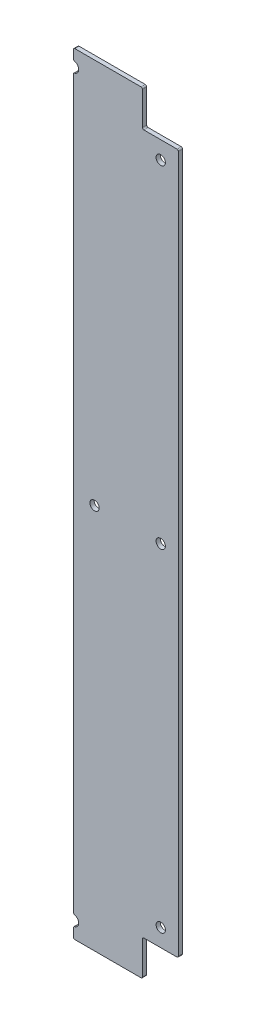
ISO-10303-21;
HEADER;
FILE_DESCRIPTION(('STEP AP214'),'2;1');
FILE_NAME('part.step','',(''),(''),'','','');
FILE_SCHEMA(('AUTOMOTIVE_DESIGN { 1 0 10303 214 1 1 1 1 }'));
ENDSEC;
DATA;
#1=APPLICATION_CONTEXT('core data for automotive mechanical design processes');
#2=APPLICATION_PROTOCOL_DEFINITION('international standard','automotive_design',2000,#1);
#3=PRODUCT_CONTEXT('',#1,'mechanical');
#4=PRODUCT('Part','Part','',(#3));
#5=PRODUCT_RELATED_PRODUCT_CATEGORY('part','',(#4));
#6=PRODUCT_DEFINITION_FORMATION('','',#4);
#7=PRODUCT_DEFINITION_CONTEXT('part definition',#1,'design');
#8=PRODUCT_DEFINITION('design','',#6,#7);
#9=PRODUCT_DEFINITION_SHAPE('','',#8);
#10=(LENGTH_UNIT() NAMED_UNIT(*) SI_UNIT(.MILLI.,.METRE.));
#11=(NAMED_UNIT(*) PLANE_ANGLE_UNIT() SI_UNIT($,.RADIAN.));
#12=(NAMED_UNIT(*) SI_UNIT($,.STERADIAN.) SOLID_ANGLE_UNIT());
#13=UNCERTAINTY_MEASURE_WITH_UNIT(LENGTH_MEASURE(1.E-05),#10,'distance_accuracy_value','');
#14=(GEOMETRIC_REPRESENTATION_CONTEXT(3) GLOBAL_UNCERTAINTY_ASSIGNED_CONTEXT((#13)) GLOBAL_UNIT_ASSIGNED_CONTEXT((#10,
#11,#12)) REPRESENTATION_CONTEXT('',''));
#15=CARTESIAN_POINT('',(0.,0.,0.));
#16=DIRECTION('',(0.,0.,1.));
#17=DIRECTION('',(1.,0.,0.));
#18=AXIS2_PLACEMENT_3D('',#15,#16,#17);
#19=CARTESIAN_POINT('',(25.5,522.5,3.));
#20=DIRECTION('',(1.,0.,0.));
#21=DIRECTION('',(0.,0.,-1.));
#22=AXIS2_PLACEMENT_3D('',#19,#20,#21);
#23=PLANE('',#22);
#24=DIRECTION('',(0.,-1.,0.));
#25=VECTOR('',#24,1.);
#26=CARTESIAN_POINT('',(25.5,522.5,3.));
#27=LINE('',#26,#25);
#28=CARTESIAN_POINT('',(25.5,-18.6435439052517,3.));
#29=VERTEX_POINT('',#28);
#30=CARTESIAN_POINT('',(25.5,-24.5,3.));
#31=VERTEX_POINT('',#30);
#32=EDGE_CURVE('E375',#29,#31,#27,.T.);
#33=ORIENTED_EDGE('',*,*,#32,.F.);
#34=DIRECTION('',(0.,0.,-1.));
#35=VECTOR('',#34,1.);
#36=CARTESIAN_POINT('',(25.5,-18.6435439052517,3.));
#37=LINE('',#36,#35);
#38=CARTESIAN_POINT('',(25.5,-18.6435439052517,0.));
#39=VERTEX_POINT('',#38);
#40=EDGE_CURVE('E315',#29,#39,#37,.T.);
#41=ORIENTED_EDGE('',*,*,#40,.T.);
#42=DIRECTION('',(0.,-1.,0.));
#43=VECTOR('',#42,1.);
#44=CARTESIAN_POINT('',(25.5,522.5,0.));
#45=LINE('',#44,#43);
#46=CARTESIAN_POINT('',(25.5,-24.5,0.));
#47=VERTEX_POINT('',#46);
#48=EDGE_CURVE('E236',#39,#47,#45,.T.);
#49=ORIENTED_EDGE('',*,*,#48,.T.);
#50=DIRECTION('',(0.,0.,-1.));
#51=VECTOR('',#50,1.);
#52=CARTESIAN_POINT('',(25.5,-24.5,3.));
#53=LINE('',#52,#51);
#54=EDGE_CURVE('E313',#47,#31,#53,.F.);
#55=ORIENTED_EDGE('',*,*,#54,.T.);
#56=EDGE_LOOP('',(#33,#41,#49,#55));
#57=FACE_BOUND('',#56,.T.);
#58=ADVANCED_FACE('F33',(#57),#23,.F.);
#59=CARTESIAN_POINT('',(25.5,506.356456094748,3.));
#60=VERTEX_POINT('',#59);
#61=CARTESIAN_POINT('',(25.5,-9.35645609474833,3.));
#62=VERTEX_POINT('',#61);
#63=EDGE_CURVE('E376',#60,#62,#27,.T.);
#64=ORIENTED_EDGE('',*,*,#63,.F.);
#65=DIRECTION('',(0.,0.,-1.));
#66=VECTOR('',#65,1.);
#67=CARTESIAN_POINT('',(25.5,506.356456094748,3.));
#68=LINE('',#67,#66);
#69=CARTESIAN_POINT('',(25.5,506.356456094748,0.));
#70=VERTEX_POINT('',#69);
#71=EDGE_CURVE('E306',#60,#70,#68,.T.);
#72=ORIENTED_EDGE('',*,*,#71,.T.);
#73=CARTESIAN_POINT('',(25.5,-9.35645609474833,0.));
#74=VERTEX_POINT('',#73);
#75=EDGE_CURVE('E241',#70,#74,#45,.T.);
#76=ORIENTED_EDGE('',*,*,#75,.T.);
#77=DIRECTION('',(0.,0.,-1.));
#78=VECTOR('',#77,1.);
#79=CARTESIAN_POINT('',(25.5,-9.35645609474833,3.));
#80=LINE('',#79,#78);
#81=EDGE_CURVE('E304',#74,#62,#80,.F.);
#82=ORIENTED_EDGE('',*,*,#81,.T.);
#83=EDGE_LOOP('',(#64,#72,#76,#82));
#84=FACE_BOUND('',#83,.T.);
#85=ADVANCED_FACE('F395',(#84),#23,.F.);
#86=CARTESIAN_POINT('',(0.,0.,0.));
#87=DIRECTION('',(0.,0.,1.));
#88=DIRECTION('',(1.,0.,0.));
#89=AXIS2_PLACEMENT_3D('',#86,#87,#88);
#90=PLANE('',#89);
#91=CARTESIAN_POINT('',(40.500000000009,248.500000000004,0.));
#92=DIRECTION('',(0.,0.,-1.));
#93=DIRECTION('',(-1.,0.,0.));
#94=AXIS2_PLACEMENT_3D('',#91,#92,#93);
#95=CIRCLE('',#94,3.29999999999999);
#96=CARTESIAN_POINT('',(37.200000000009,248.500000000004,0.));
#97=VERTEX_POINT('',#96);
#98=EDGE_CURVE('E702',#97,#97,#95,.T.);
#99=ORIENTED_EDGE('',*,*,#98,.F.);
#100=EDGE_LOOP('',(#99));
#101=FACE_BOUND('',#100,.T.);
#102=CARTESIAN_POINT('',(87.5,484.5,0.));
#103=DIRECTION('',(0.,0.,-1.));
#104=DIRECTION('',(-1.,0.,0.));
#105=AXIS2_PLACEMENT_3D('',#102,#103,#104);
#106=CIRCLE('',#105,3.29999999999998);
#107=CARTESIAN_POINT('',(84.2,484.5,0.));
#108=VERTEX_POINT('',#107);
#109=EDGE_CURVE('E690',#108,#108,#106,.T.);
#110=ORIENTED_EDGE('',*,*,#109,.F.);
#111=EDGE_LOOP('',(#110));
#112=FACE_BOUND('',#111,.T.);
#113=CARTESIAN_POINT('',(87.5,248.5,0.));
#114=DIRECTION('',(0.,0.,-1.));
#115=DIRECTION('',(-1.,0.,0.));
#116=AXIS2_PLACEMENT_3D('',#113,#114,#115);
#117=CIRCLE('',#116,3.29999999999998);
#118=CARTESIAN_POINT('',(84.2,248.5,0.));
#119=VERTEX_POINT('',#118);
#120=EDGE_CURVE('E681',#119,#119,#117,.T.);
#121=ORIENTED_EDGE('',*,*,#120,.F.);
#122=EDGE_LOOP('',(#121));
#123=FACE_BOUND('',#122,.T.);
#124=DIRECTION('',(-1.,0.,0.));
#125=VECTOR('',#124,1.);
#126=CARTESIAN_POINT('',(99.9999999999999,497.,0.));
#127=LINE('',#126,#125);
#128=CARTESIAN_POINT('',(98.9999999999999,497.,0.));
#129=VERTEX_POINT('',#128);
#130=CARTESIAN_POINT('',(75.5,497.,0.));
#131=VERTEX_POINT('',#130);
#132=EDGE_CURVE('E213',#129,#131,#127,.T.);
#133=ORIENTED_EDGE('',*,*,#132,.F.);
#134=CARTESIAN_POINT('',(98.9999999999999,496.,0.));
#135=DIRECTION('',(0.,0.,1.));
#136=DIRECTION('',(1.,0.,0.));
#137=AXIS2_PLACEMENT_3D('',#134,#135,#136);
#138=CIRCLE('',#137,1.);
#139=CARTESIAN_POINT('',(99.9999999999999,496.,0.));
#140=VERTEX_POINT('',#139);
#141=EDGE_CURVE('E196',#129,#140,#138,.F.);
#142=ORIENTED_EDGE('',*,*,#141,.T.);
#143=DIRECTION('',(0.,1.,0.));
#144=VECTOR('',#143,1.);
#145=CARTESIAN_POINT('',(100.,0.,0.));
#146=LINE('',#145,#144);
#147=CARTESIAN_POINT('',(100.,0.99999999999999,0.));
#148=VERTEX_POINT('',#147);
#149=EDGE_CURVE('E225',#148,#140,#146,.T.);
#150=ORIENTED_EDGE('',*,*,#149,.F.);
#151=CARTESIAN_POINT('',(99.,0.99999999999999,0.));
#152=DIRECTION('',(0.,0.,1.));
#153=DIRECTION('',(1.,0.,0.));
#154=AXIS2_PLACEMENT_3D('',#151,#152,#153);
#155=CIRCLE('',#154,1.);
#156=CARTESIAN_POINT('',(99.,0.,0.));
#157=VERTEX_POINT('',#156);
#158=EDGE_CURVE('E217',#148,#157,#155,.F.);
#159=ORIENTED_EDGE('',*,*,#158,.T.);
#160=DIRECTION('',(1.,0.,0.));
#161=VECTOR('',#160,1.);
#162=CARTESIAN_POINT('',(100.,0.,0.));
#163=LINE('',#162,#161);
#164=CARTESIAN_POINT('',(75.5,0.,0.));
#165=VERTEX_POINT('',#164);
#166=EDGE_CURVE('E230',#165,#157,#163,.T.);
#167=ORIENTED_EDGE('',*,*,#166,.F.);
#168=CARTESIAN_POINT('',(75.5,-1.00000000000001,0.));
#169=DIRECTION('',(0.,0.,1.));
#170=DIRECTION('',(1.,0.,0.));
#171=AXIS2_PLACEMENT_3D('',#168,#169,#170);
#172=CIRCLE('',#171,1.);
#173=CARTESIAN_POINT('',(74.5,-1.00000000000001,0.));
#174=VERTEX_POINT('',#173);
#175=EDGE_CURVE('E41',#165,#174,#172,.T.);
#176=ORIENTED_EDGE('',*,*,#175,.T.);
#177=DIRECTION('',(0.,1.,0.));
#178=VECTOR('',#177,1.);
#179=CARTESIAN_POINT('',(74.5,-25.5,0.));
#180=LINE('',#179,#178);
#181=CARTESIAN_POINT('',(74.5,-24.5,0.));
#182=VERTEX_POINT('',#181);
#183=EDGE_CURVE('E338',#182,#174,#180,.T.);
#184=ORIENTED_EDGE('',*,*,#183,.F.);
#185=CARTESIAN_POINT('',(73.5,-24.5,0.));
#186=DIRECTION('',(0.,0.,1.));
#187=DIRECTION('',(1.,0.,0.));
#188=AXIS2_PLACEMENT_3D('',#185,#186,#187);
#189=CIRCLE('',#188,1.);
#190=CARTESIAN_POINT('',(73.5,-25.5,0.));
#191=VERTEX_POINT('',#190);
#192=EDGE_CURVE('E248',#182,#191,#189,.F.);
#193=ORIENTED_EDGE('',*,*,#192,.T.);
#194=DIRECTION('',(1.,0.,0.));
#195=VECTOR('',#194,1.);
#196=CARTESIAN_POINT('',(25.5,-25.5,0.));
#197=LINE('',#196,#195);
#198=CARTESIAN_POINT('',(26.5,-25.5,0.));
#199=VERTEX_POINT('',#198);
#200=EDGE_CURVE('E240',#199,#191,#197,.T.);
#201=ORIENTED_EDGE('',*,*,#200,.F.);
#202=CARTESIAN_POINT('',(26.5,-24.5,0.));
#203=DIRECTION('',(0.,0.,1.));
#204=DIRECTION('',(1.,0.,0.));
#205=AXIS2_PLACEMENT_3D('',#202,#203,#204);
#206=CIRCLE('',#205,1.);
#207=EDGE_CURVE('E250',#199,#47,#206,.F.);
#208=ORIENTED_EDGE('',*,*,#207,.T.);
#209=ORIENTED_EDGE('',*,*,#48,.F.);
#210=CARTESIAN_POINT('',(26.5,-18.6435439052517,0.));
#211=DIRECTION('',(0.,0.,1.));
#212=DIRECTION('',(1.,0.,0.));
#213=AXIS2_PLACEMENT_3D('',#210,#211,#212);
#214=CIRCLE('',#213,1.);
#215=CARTESIAN_POINT('',(26.2894736842105,-17.6659557146724,0.));
#216=VERTEX_POINT('',#215);
#217=EDGE_CURVE('E252',#39,#216,#214,.F.);
#218=ORIENTED_EDGE('',*,*,#217,.T.);
#219=CARTESIAN_POINT('',(25.5,-14.,0.));
#220=DIRECTION('',(0.,0.,-1.));
#221=DIRECTION('',(-1.,0.,0.));
#222=AXIS2_PLACEMENT_3D('',#219,#220,#221);
#223=CIRCLE('',#222,3.75);
#224=CARTESIAN_POINT('',(26.2894736842105,-10.3340442853276,0.));
#225=VERTEX_POINT('',#224);
#226=EDGE_CURVE('E711',#225,#216,#223,.T.);
#227=ORIENTED_EDGE('',*,*,#226,.F.);
#228=CARTESIAN_POINT('',(26.5,-9.35645609474834,0.));
#229=DIRECTION('',(0.,0.,1.));
#230=DIRECTION('',(1.,0.,0.));
#231=AXIS2_PLACEMENT_3D('',#228,#229,#230);
#232=CIRCLE('',#231,1.);
#233=EDGE_CURVE('E254',#225,#74,#232,.F.);
#234=ORIENTED_EDGE('',*,*,#233,.T.);
#235=ORIENTED_EDGE('',*,*,#75,.F.);
#236=CARTESIAN_POINT('',(26.5,506.356456094748,0.));
#237=DIRECTION('',(0.,0.,1.));
#238=DIRECTION('',(1.,0.,0.));
#239=AXIS2_PLACEMENT_3D('',#236,#237,#238);
#240=CIRCLE('',#239,1.);
#241=CARTESIAN_POINT('',(26.2894736842105,507.334044285328,0.));
#242=VERTEX_POINT('',#241);
#243=EDGE_CURVE('E256',#70,#242,#240,.F.);
#244=ORIENTED_EDGE('',*,*,#243,.T.);
#245=CARTESIAN_POINT('',(25.5,511.,0.));
#246=DIRECTION('',(0.,0.,-1.));
#247=DIRECTION('',(-1.,0.,0.));
#248=AXIS2_PLACEMENT_3D('',#245,#246,#247);
#249=CIRCLE('',#248,3.74999999999997);
#250=CARTESIAN_POINT('',(26.2894736842105,514.665955714672,0.));
#251=VERTEX_POINT('',#250);
#252=EDGE_CURVE('E706',#251,#242,#249,.T.);
#253=ORIENTED_EDGE('',*,*,#252,.F.);
#254=CARTESIAN_POINT('',(26.5,515.643543905252,0.));
#255=DIRECTION('',(0.,0.,1.));
#256=DIRECTION('',(1.,0.,0.));
#257=AXIS2_PLACEMENT_3D('',#254,#255,#256);
#258=CIRCLE('',#257,1.);
#259=CARTESIAN_POINT('',(25.5,515.643543905252,0.));
#260=VERTEX_POINT('',#259);
#261=EDGE_CURVE('E258',#251,#260,#258,.F.);
#262=ORIENTED_EDGE('',*,*,#261,.T.);
#263=CARTESIAN_POINT('',(25.5,521.5,0.));
#264=VERTEX_POINT('',#263);
#265=EDGE_CURVE('E237',#264,#260,#45,.T.);
#266=ORIENTED_EDGE('',*,*,#265,.F.);
#267=CARTESIAN_POINT('',(26.5,521.5,0.));
#268=DIRECTION('',(0.,0.,1.));
#269=DIRECTION('',(1.,0.,0.));
#270=AXIS2_PLACEMENT_3D('',#267,#268,#269);
#271=CIRCLE('',#270,1.);
#272=CARTESIAN_POINT('',(26.5,522.5,0.));
#273=VERTEX_POINT('',#272);
#274=EDGE_CURVE('E260',#264,#273,#271,.F.);
#275=ORIENTED_EDGE('',*,*,#274,.T.);
#276=DIRECTION('',(-1.,0.,0.));
#277=VECTOR('',#276,1.);
#278=CARTESIAN_POINT('',(25.5,522.5,0.));
#279=LINE('',#278,#277);
#280=CARTESIAN_POINT('',(73.5,522.5,0.));
#281=VERTEX_POINT('',#280);
#282=EDGE_CURVE('E228',#281,#273,#279,.T.);
#283=ORIENTED_EDGE('',*,*,#282,.F.);
#284=CARTESIAN_POINT('',(73.5,521.5,0.));
#285=DIRECTION('',(0.,0.,1.));
#286=DIRECTION('',(1.,0.,0.));
#287=AXIS2_PLACEMENT_3D('',#284,#285,#286);
#288=CIRCLE('',#287,1.);
#289=CARTESIAN_POINT('',(74.5,521.5,0.));
#290=VERTEX_POINT('',#289);
#291=EDGE_CURVE('E207',#281,#290,#288,.F.);
#292=ORIENTED_EDGE('',*,*,#291,.T.);
#293=DIRECTION('',(0.,1.,0.));
#294=VECTOR('',#293,1.);
#295=CARTESIAN_POINT('',(74.5,522.5,0.));
#296=LINE('',#295,#294);
#297=CARTESIAN_POINT('',(74.5,498.,0.));
#298=VERTEX_POINT('',#297);
#299=EDGE_CURVE('E224',#298,#290,#296,.T.);
#300=ORIENTED_EDGE('',*,*,#299,.F.);
#301=CARTESIAN_POINT('',(75.5,498.,0.));
#302=DIRECTION('',(0.,0.,1.));
#303=DIRECTION('',(1.,0.,0.));
#304=AXIS2_PLACEMENT_3D('',#301,#302,#303);
#305=CIRCLE('',#304,1.);
#306=EDGE_CURVE('E223',#298,#131,#305,.T.);
#307=ORIENTED_EDGE('',*,*,#306,.T.);
#308=EDGE_LOOP('',(#133,#142,#150,#159,#167,#176,#184,#193,#201,#208,#209,#218,#227,#234,#235,
#244,#253,#262,#266,#275,#283,#292,#300,#307));
#309=FACE_BOUND('',#308,.T.);
#310=CARTESIAN_POINT('',(87.5,12.5,0.));
#311=DIRECTION('',(0.,0.,-1.));
#312=DIRECTION('',(-1.,0.,0.));
#313=AXIS2_PLACEMENT_3D('',#310,#311,#312);
#314=CIRCLE('',#313,3.29999999999998);
#315=CARTESIAN_POINT('',(84.2,12.5,0.));
#316=VERTEX_POINT('',#315);
#317=EDGE_CURVE('E696',#316,#316,#314,.T.);
#318=ORIENTED_EDGE('',*,*,#317,.F.);
#319=EDGE_LOOP('',(#318));
#320=FACE_BOUND('',#319,.T.);
#321=ADVANCED_FACE('F220',(#101,#112,#123,#309,#320),#90,.F.);
#322=CARTESIAN_POINT('',(74.5,-25.5,3.));
#323=DIRECTION('',(-1.,0.,0.));
#324=DIRECTION('',(0.,0.,1.));
#325=AXIS2_PLACEMENT_3D('',#322,#323,#324);
#326=PLANE('',#325);
#327=DIRECTION('',(0.,1.,0.));
#328=VECTOR('',#327,1.);
#329=CARTESIAN_POINT('',(74.5,-25.5,3.));
#330=LINE('',#329,#328);
#331=CARTESIAN_POINT('',(74.5,-24.5,3.));
#332=VERTEX_POINT('',#331);
#333=CARTESIAN_POINT('',(74.5,-1.00000000000001,3.));
#334=VERTEX_POINT('',#333);
#335=EDGE_CURVE('E244',#332,#334,#330,.T.);
#336=ORIENTED_EDGE('',*,*,#335,.F.);
#337=DIRECTION('',(0.,0.,-1.));
#338=VECTOR('',#337,1.);
#339=CARTESIAN_POINT('',(74.5,-24.5,3.));
#340=LINE('',#339,#338);
#341=EDGE_CURVE('E325',#332,#182,#340,.T.);
#342=ORIENTED_EDGE('',*,*,#341,.T.);
#343=ORIENTED_EDGE('',*,*,#183,.T.);
#344=DIRECTION('',(0.,0.,-1.));
#345=VECTOR('',#344,1.);
#346=CARTESIAN_POINT('',(74.5,-1.00000000000001,3.));
#347=LINE('',#346,#345);
#348=EDGE_CURVE('E323',#174,#334,#347,.F.);
#349=ORIENTED_EDGE('',*,*,#348,.T.);
#350=EDGE_LOOP('',(#336,#342,#343,#349));
#351=FACE_BOUND('',#350,.T.);
#352=ADVANCED_FACE('F345',(#351),#326,.F.);
#353=CARTESIAN_POINT('',(100.,0.,3.));
#354=DIRECTION('',(0.,1.,0.));
#355=DIRECTION('',(-1.,0.,0.));
#356=AXIS2_PLACEMENT_3D('',#353,#354,#355);
#357=PLANE('',#356);
#358=DIRECTION('',(1.,0.,0.));
#359=VECTOR('',#358,1.);
#360=CARTESIAN_POINT('',(100.,0.,3.));
#361=LINE('',#360,#359);
#362=CARTESIAN_POINT('',(75.5,0.,3.));
#363=VERTEX_POINT('',#362);
#364=CARTESIAN_POINT('',(99.,0.,3.));
#365=VERTEX_POINT('',#364);
#366=EDGE_CURVE('E357',#363,#365,#361,.T.);
#367=ORIENTED_EDGE('',*,*,#366,.F.);
#368=DIRECTION('',(0.,0.,-1.));
#369=VECTOR('',#368,1.);
#370=CARTESIAN_POINT('',(75.5,0.,0.));
#371=LINE('',#370,#369);
#372=EDGE_CURVE('E330',#363,#165,#371,.T.);
#373=ORIENTED_EDGE('',*,*,#372,.T.);
#374=ORIENTED_EDGE('',*,*,#166,.T.);
#375=DIRECTION('',(0.,0.,-1.));
#376=VECTOR('',#375,1.);
#377=CARTESIAN_POINT('',(99.,0.,3.));
#378=LINE('',#377,#376);
#379=EDGE_CURVE('E328',#157,#365,#378,.F.);
#380=ORIENTED_EDGE('',*,*,#379,.T.);
#381=EDGE_LOOP('',(#367,#373,#374,#380));
#382=FACE_BOUND('',#381,.T.);
#383=ADVANCED_FACE('F360',(#382),#357,.F.);
#384=CARTESIAN_POINT('',(100.,0.,3.));
#385=DIRECTION('',(-1.,0.,0.));
#386=DIRECTION('',(0.,-1.,0.));
#387=AXIS2_PLACEMENT_3D('',#384,#385,#386);
#388=PLANE('',#387);
#389=ORIENTED_EDGE('',*,*,#149,.T.);
#390=DIRECTION('',(0.,0.,-1.));
#391=VECTOR('',#390,1.);
#392=CARTESIAN_POINT('',(99.9999999999999,496.,3.));
#393=LINE('',#392,#391);
#394=CARTESIAN_POINT('',(99.9999999999999,496.,3.));
#395=VERTEX_POINT('',#394);
#396=EDGE_CURVE('E201',#140,#395,#393,.F.);
#397=ORIENTED_EDGE('',*,*,#396,.T.);
#398=DIRECTION('',(0.,1.,0.));
#399=VECTOR('',#398,1.);
#400=CARTESIAN_POINT('',(100.,0.,3.));
#401=LINE('',#400,#399);
#402=CARTESIAN_POINT('',(100.,0.99999999999999,3.));
#403=VERTEX_POINT('',#402);
#404=EDGE_CURVE('E362',#403,#395,#401,.T.);
#405=ORIENTED_EDGE('',*,*,#404,.F.);
#406=DIRECTION('',(0.,0.,-1.));
#407=VECTOR('',#406,1.);
#408=CARTESIAN_POINT('',(100.,0.99999999999999,3.));
#409=LINE('',#408,#407);
#410=EDGE_CURVE('E206',#403,#148,#409,.T.);
#411=ORIENTED_EDGE('',*,*,#410,.T.);
#412=EDGE_LOOP('',(#389,#397,#405,#411));
#413=FACE_BOUND('',#412,.T.);
#414=ADVANCED_FACE('F384',(#413),#388,.F.);
#415=CARTESIAN_POINT('',(99.9999999999999,497.,3.));
#416=DIRECTION('',(0.,-1.,0.));
#417=DIRECTION('',(0.,0.,-1.));
#418=AXIS2_PLACEMENT_3D('',#415,#416,#417);
#419=PLANE('',#418);
#420=DIRECTION('',(-1.,0.,0.));
#421=VECTOR('',#420,1.);
#422=CARTESIAN_POINT('',(99.9999999999999,497.,3.));
#423=LINE('',#422,#421);
#424=CARTESIAN_POINT('',(98.9999999999999,497.,3.));
#425=VERTEX_POINT('',#424);
#426=CARTESIAN_POINT('',(75.5,497.,3.));
#427=VERTEX_POINT('',#426);
#428=EDGE_CURVE('E216',#425,#427,#423,.T.);
#429=ORIENTED_EDGE('',*,*,#428,.F.);
#430=DIRECTION('',(0.,0.,-1.));
#431=VECTOR('',#430,1.);
#432=CARTESIAN_POINT('',(98.9999999999999,497.,3.));
#433=LINE('',#432,#431);
#434=EDGE_CURVE('E200',#425,#129,#433,.T.);
#435=ORIENTED_EDGE('',*,*,#434,.T.);
#436=ORIENTED_EDGE('',*,*,#132,.T.);
#437=DIRECTION('',(0.,0.,-1.));
#438=VECTOR('',#437,1.);
#439=CARTESIAN_POINT('',(75.5,497.,3.));
#440=LINE('',#439,#438);
#441=EDGE_CURVE('E218',#131,#427,#440,.F.);
#442=ORIENTED_EDGE('',*,*,#441,.T.);
#443=EDGE_LOOP('',(#429,#435,#436,#442));
#444=FACE_BOUND('',#443,.T.);
#445=ADVANCED_FACE('F212',(#444),#419,.F.);
#446=CARTESIAN_POINT('',(74.5,522.5,3.));
#447=DIRECTION('',(-1.,0.,0.));
#448=DIRECTION('',(0.,0.,1.));
#449=AXIS2_PLACEMENT_3D('',#446,#447,#448);
#450=PLANE('',#449);
#451=DIRECTION('',(0.,1.,0.));
#452=VECTOR('',#451,1.);
#453=CARTESIAN_POINT('',(74.5,522.5,3.));
#454=LINE('',#453,#452);
#455=CARTESIAN_POINT('',(74.5,498.,3.));
#456=VERTEX_POINT('',#455);
#457=CARTESIAN_POINT('',(74.5,521.5,3.));
#458=VERTEX_POINT('',#457);
#459=EDGE_CURVE('E369',#456,#458,#454,.T.);
#460=ORIENTED_EDGE('',*,*,#459,.F.);
#461=DIRECTION('',(0.,0.,-1.));
#462=VECTOR('',#461,1.);
#463=CARTESIAN_POINT('',(74.5,498.,0.));
#464=LINE('',#463,#462);
#465=EDGE_CURVE('E286',#456,#298,#464,.T.);
#466=ORIENTED_EDGE('',*,*,#465,.T.);
#467=ORIENTED_EDGE('',*,*,#299,.T.);
#468=DIRECTION('',(0.,0.,-1.));
#469=VECTOR('',#468,1.);
#470=CARTESIAN_POINT('',(74.5,521.5,3.));
#471=LINE('',#470,#469);
#472=EDGE_CURVE('E284',#290,#458,#471,.F.);
#473=ORIENTED_EDGE('',*,*,#472,.T.);
#474=EDGE_LOOP('',(#460,#466,#467,#473));
#475=FACE_BOUND('',#474,.T.);
#476=ADVANCED_FACE('F391',(#475),#450,.F.);
#477=CARTESIAN_POINT('',(25.5,522.5,3.));
#478=DIRECTION('',(0.,-1.,0.));
#479=DIRECTION('',(0.,0.,-1.));
#480=AXIS2_PLACEMENT_3D('',#477,#478,#479);
#481=PLANE('',#480);
#482=DIRECTION('',(-1.,0.,0.));
#483=VECTOR('',#482,1.);
#484=CARTESIAN_POINT('',(25.5,522.5,3.));
#485=LINE('',#484,#483);
#486=CARTESIAN_POINT('',(73.5,522.5,3.));
#487=VERTEX_POINT('',#486);
#488=CARTESIAN_POINT('',(26.5,522.5,3.));
#489=VERTEX_POINT('',#488);
#490=EDGE_CURVE('E372',#487,#489,#485,.T.);
#491=ORIENTED_EDGE('',*,*,#490,.F.);
#492=DIRECTION('',(0.,0.,-1.));
#493=VECTOR('',#492,1.);
#494=CARTESIAN_POINT('',(73.5,522.5,3.));
#495=LINE('',#494,#493);
#496=EDGE_CURVE('E291',#487,#281,#495,.T.);
#497=ORIENTED_EDGE('',*,*,#496,.T.);
#498=ORIENTED_EDGE('',*,*,#282,.T.);
#499=DIRECTION('',(0.,0.,-1.));
#500=VECTOR('',#499,1.);
#501=CARTESIAN_POINT('',(26.5,522.5,3.));
#502=LINE('',#501,#500);
#503=EDGE_CURVE('E289',#273,#489,#502,.F.);
#504=ORIENTED_EDGE('',*,*,#503,.T.);
#505=EDGE_LOOP('',(#491,#497,#498,#504));
#506=FACE_BOUND('',#505,.T.);
#507=ADVANCED_FACE('F408',(#506),#481,.F.);
#508=CARTESIAN_POINT('',(25.5,521.5,3.));
#509=VERTEX_POINT('',#508);
#510=CARTESIAN_POINT('',(25.5,515.643543905252,3.));
#511=VERTEX_POINT('',#510);
#512=EDGE_CURVE('E378',#509,#511,#27,.T.);
#513=ORIENTED_EDGE('',*,*,#512,.F.);
#514=DIRECTION('',(0.,0.,-1.));
#515=VECTOR('',#514,1.);
#516=CARTESIAN_POINT('',(25.5,521.5,3.));
#517=LINE('',#516,#515);
#518=EDGE_CURVE('E297',#509,#264,#517,.T.);
#519=ORIENTED_EDGE('',*,*,#518,.T.);
#520=ORIENTED_EDGE('',*,*,#265,.T.);
#521=DIRECTION('',(0.,0.,-1.));
#522=VECTOR('',#521,1.);
#523=CARTESIAN_POINT('',(25.5,515.643543905252,3.));
#524=LINE('',#523,#522);
#525=EDGE_CURVE('E294',#260,#511,#524,.F.);
#526=ORIENTED_EDGE('',*,*,#525,.T.);
#527=EDGE_LOOP('',(#513,#519,#520,#526));
#528=FACE_BOUND('',#527,.T.);
#529=ADVANCED_FACE('F398',(#528),#23,.F.);
#530=CARTESIAN_POINT('',(25.5,-25.5,3.));
#531=DIRECTION('',(0.,1.,0.));
#532=DIRECTION('',(0.,0.,1.));
#533=AXIS2_PLACEMENT_3D('',#530,#531,#532);
#534=PLANE('',#533);
#535=DIRECTION('',(1.,0.,0.));
#536=VECTOR('',#535,1.);
#537=CARTESIAN_POINT('',(25.5,-25.5,3.));
#538=LINE('',#537,#536);
#539=CARTESIAN_POINT('',(26.5,-25.5,3.));
#540=VERTEX_POINT('',#539);
#541=CARTESIAN_POINT('',(73.5,-25.5,3.));
#542=VERTEX_POINT('',#541);
#543=EDGE_CURVE('E245',#540,#542,#538,.T.);
#544=ORIENTED_EDGE('',*,*,#543,.F.);
#545=DIRECTION('',(0.,0.,-1.));
#546=VECTOR('',#545,1.);
#547=CARTESIAN_POINT('',(26.5,-25.5,3.));
#548=LINE('',#547,#546);
#549=EDGE_CURVE('E320',#540,#199,#548,.T.);
#550=ORIENTED_EDGE('',*,*,#549,.T.);
#551=ORIENTED_EDGE('',*,*,#200,.T.);
#552=DIRECTION('',(0.,0.,-1.));
#553=VECTOR('',#552,1.);
#554=CARTESIAN_POINT('',(73.5,-25.5,3.));
#555=LINE('',#554,#553);
#556=EDGE_CURVE('E318',#191,#542,#555,.F.);
#557=ORIENTED_EDGE('',*,*,#556,.T.);
#558=EDGE_LOOP('',(#544,#550,#551,#557));
#559=FACE_BOUND('',#558,.T.);
#560=ADVANCED_FACE('F407',(#559),#534,.F.);
#561=CARTESIAN_POINT('',(0.,0.,3.));
#562=DIRECTION('',(0.,0.,1.));
#563=DIRECTION('',(1.,0.,0.));
#564=AXIS2_PLACEMENT_3D('',#561,#562,#563);
#565=PLANE('',#564);
#566=ORIENTED_EDGE('',*,*,#404,.T.);
#567=CARTESIAN_POINT('',(98.9999999999999,496.,3.));
#568=DIRECTION('',(0.,0.,1.));
#569=DIRECTION('',(1.,0.,0.));
#570=AXIS2_PLACEMENT_3D('',#567,#568,#569);
#571=CIRCLE('',#570,1.);
#572=EDGE_CURVE('E282',#395,#425,#571,.T.);
#573=ORIENTED_EDGE('',*,*,#572,.T.);
#574=ORIENTED_EDGE('',*,*,#428,.T.);
#575=CARTESIAN_POINT('',(75.5,498.,3.));
#576=DIRECTION('',(0.,0.,1.));
#577=DIRECTION('',(1.,0.,0.));
#578=AXIS2_PLACEMENT_3D('',#575,#576,#577);
#579=CIRCLE('',#578,1.);
#580=EDGE_CURVE('E334',#427,#456,#579,.F.);
#581=ORIENTED_EDGE('',*,*,#580,.T.);
#582=ORIENTED_EDGE('',*,*,#459,.T.);
#583=CARTESIAN_POINT('',(73.5,521.5,3.));
#584=DIRECTION('',(0.,0.,1.));
#585=DIRECTION('',(1.,0.,0.));
#586=AXIS2_PLACEMENT_3D('',#583,#584,#585);
#587=CIRCLE('',#586,1.);
#588=EDGE_CURVE('E280',#458,#487,#587,.T.);
#589=ORIENTED_EDGE('',*,*,#588,.T.);
#590=ORIENTED_EDGE('',*,*,#490,.T.);
#591=CARTESIAN_POINT('',(26.5,521.5,3.));
#592=DIRECTION('',(0.,0.,1.));
#593=DIRECTION('',(1.,0.,0.));
#594=AXIS2_PLACEMENT_3D('',#591,#592,#593);
#595=CIRCLE('',#594,1.);
#596=EDGE_CURVE('E278',#489,#509,#595,.T.);
#597=ORIENTED_EDGE('',*,*,#596,.T.);
#598=ORIENTED_EDGE('',*,*,#512,.T.);
#599=CARTESIAN_POINT('',(26.5,515.643543905252,3.));
#600=DIRECTION('',(0.,0.,1.));
#601=DIRECTION('',(1.,0.,0.));
#602=AXIS2_PLACEMENT_3D('',#599,#600,#601);
#603=CIRCLE('',#602,1.);
#604=CARTESIAN_POINT('',(26.2894736842105,514.665955714672,3.));
#605=VERTEX_POINT('',#604);
#606=EDGE_CURVE('E276',#511,#605,#603,.T.);
#607=ORIENTED_EDGE('',*,*,#606,.T.);
#608=CARTESIAN_POINT('',(25.5,511.,3.));
#609=DIRECTION('',(0.,0.,-1.));
#610=DIRECTION('',(-1.,0.,0.));
#611=AXIS2_PLACEMENT_3D('',#608,#609,#610);
#612=CIRCLE('',#611,3.74999999999997);
#613=CARTESIAN_POINT('',(26.2894736842105,507.334044285328,3.));
#614=VERTEX_POINT('',#613);
#615=EDGE_CURVE('E709',#605,#614,#612,.T.);
#616=ORIENTED_EDGE('',*,*,#615,.T.);
#617=CARTESIAN_POINT('',(26.5,506.356456094748,3.));
#618=DIRECTION('',(0.,0.,1.));
#619=DIRECTION('',(1.,0.,0.));
#620=AXIS2_PLACEMENT_3D('',#617,#618,#619);
#621=CIRCLE('',#620,1.);
#622=EDGE_CURVE('E56',#614,#60,#621,.T.);
#623=ORIENTED_EDGE('',*,*,#622,.T.);
#624=ORIENTED_EDGE('',*,*,#63,.T.);
#625=CARTESIAN_POINT('',(26.5,-9.35645609474834,3.));
#626=DIRECTION('',(0.,0.,1.));
#627=DIRECTION('',(1.,0.,0.));
#628=AXIS2_PLACEMENT_3D('',#625,#626,#627);
#629=CIRCLE('',#628,1.);
#630=CARTESIAN_POINT('',(26.2894736842105,-10.3340442853276,3.));
#631=VERTEX_POINT('',#630);
#632=EDGE_CURVE('E48',#62,#631,#629,.T.);
#633=ORIENTED_EDGE('',*,*,#632,.T.);
#634=CARTESIAN_POINT('',(25.5,-14.,3.));
#635=DIRECTION('',(0.,0.,-1.));
#636=DIRECTION('',(-1.,0.,0.));
#637=AXIS2_PLACEMENT_3D('',#634,#635,#636);
#638=CIRCLE('',#637,3.75);
#639=CARTESIAN_POINT('',(26.2894736842105,-17.6659557146724,3.));
#640=VERTEX_POINT('',#639);
#641=EDGE_CURVE('E705',#631,#640,#638,.T.);
#642=ORIENTED_EDGE('',*,*,#641,.T.);
#643=CARTESIAN_POINT('',(26.5,-18.6435439052517,3.));
#644=DIRECTION('',(0.,0.,1.));
#645=DIRECTION('',(1.,0.,0.));
#646=AXIS2_PLACEMENT_3D('',#643,#644,#645);
#647=CIRCLE('',#646,1.);
#648=EDGE_CURVE('E272',#640,#29,#647,.T.);
#649=ORIENTED_EDGE('',*,*,#648,.T.);
#650=ORIENTED_EDGE('',*,*,#32,.T.);
#651=CARTESIAN_POINT('',(26.5,-24.5,3.));
#652=DIRECTION('',(0.,0.,1.));
#653=DIRECTION('',(1.,0.,0.));
#654=AXIS2_PLACEMENT_3D('',#651,#652,#653);
#655=CIRCLE('',#654,1.);
#656=EDGE_CURVE('E270',#31,#540,#655,.T.);
#657=ORIENTED_EDGE('',*,*,#656,.T.);
#658=ORIENTED_EDGE('',*,*,#543,.T.);
#659=CARTESIAN_POINT('',(73.5,-24.5,3.));
#660=DIRECTION('',(0.,0.,1.));
#661=DIRECTION('',(1.,0.,0.));
#662=AXIS2_PLACEMENT_3D('',#659,#660,#661);
#663=CIRCLE('',#662,1.);
#664=EDGE_CURVE('E268',#542,#332,#663,.T.);
#665=ORIENTED_EDGE('',*,*,#664,.T.);
#666=ORIENTED_EDGE('',*,*,#335,.T.);
#667=CARTESIAN_POINT('',(75.5,-1.00000000000001,3.));
#668=DIRECTION('',(0.,0.,1.));
#669=DIRECTION('',(1.,0.,0.));
#670=AXIS2_PLACEMENT_3D('',#667,#668,#669);
#671=CIRCLE('',#670,1.);
#672=EDGE_CURVE('E11',#334,#363,#671,.F.);
#673=ORIENTED_EDGE('',*,*,#672,.T.);
#674=ORIENTED_EDGE('',*,*,#366,.T.);
#675=CARTESIAN_POINT('',(99.,0.99999999999999,3.));
#676=DIRECTION('',(0.,0.,1.));
#677=DIRECTION('',(1.,0.,0.));
#678=AXIS2_PLACEMENT_3D('',#675,#676,#677);
#679=CIRCLE('',#678,1.);
#680=EDGE_CURVE('E266',#365,#403,#679,.T.);
#681=ORIENTED_EDGE('',*,*,#680,.T.);
#682=EDGE_LOOP('',(#566,#573,#574,#581,#582,#589,#590,#597,#598,#607,#616,#623,#624,#633,#642,
#649,#650,#657,#658,#665,#666,#673,#674,#681));
#683=FACE_BOUND('',#682,.T.);
#684=CARTESIAN_POINT('',(40.500000000009,248.500000000004,3.));
#685=DIRECTION('',(0.,0.,1.));
#686=DIRECTION('',(1.,0.,0.));
#687=AXIS2_PLACEMENT_3D('',#684,#685,#686);
#688=CIRCLE('',#687,3.29999999999999);
#689=CARTESIAN_POINT('',(43.800000000009,248.500000000004,3.));
#690=VERTEX_POINT('',#689);
#691=EDGE_CURVE('E699',#690,#690,#688,.T.);
#692=ORIENTED_EDGE('',*,*,#691,.F.);
#693=EDGE_LOOP('',(#692));
#694=FACE_BOUND('',#693,.T.);
#695=CARTESIAN_POINT('',(87.5,12.5,3.));
#696=DIRECTION('',(0.,0.,1.));
#697=DIRECTION('',(1.,0.,0.));
#698=AXIS2_PLACEMENT_3D('',#695,#696,#697);
#699=CIRCLE('',#698,3.29999999999999);
#700=CARTESIAN_POINT('',(90.8,12.5,3.));
#701=VERTEX_POINT('',#700);
#702=EDGE_CURVE('E693',#701,#701,#699,.T.);
#703=ORIENTED_EDGE('',*,*,#702,.F.);
#704=EDGE_LOOP('',(#703));
#705=FACE_BOUND('',#704,.T.);
#706=CARTESIAN_POINT('',(87.5,484.5,3.));
#707=DIRECTION('',(0.,0.,1.));
#708=DIRECTION('',(1.,0.,0.));
#709=AXIS2_PLACEMENT_3D('',#706,#707,#708);
#710=CIRCLE('',#709,3.29999999999999);
#711=CARTESIAN_POINT('',(90.8,484.5,3.));
#712=VERTEX_POINT('',#711);
#713=EDGE_CURVE('E685',#712,#712,#710,.T.);
#714=ORIENTED_EDGE('',*,*,#713,.F.);
#715=EDGE_LOOP('',(#714));
#716=FACE_BOUND('',#715,.T.);
#717=CARTESIAN_POINT('',(87.5,248.5,3.));
#718=DIRECTION('',(0.,0.,1.));
#719=DIRECTION('',(1.,0.,0.));
#720=AXIS2_PLACEMENT_3D('',#717,#718,#719);
#721=CIRCLE('',#720,3.29999999999999);
#722=CARTESIAN_POINT('',(90.8,248.5,3.));
#723=VERTEX_POINT('',#722);
#724=EDGE_CURVE('E348',#723,#723,#721,.T.);
#725=ORIENTED_EDGE('',*,*,#724,.F.);
#726=EDGE_LOOP('',(#725));
#727=FACE_BOUND('',#726,.T.);
#728=ADVANCED_FACE('F355',(#683,#694,#705,#716,#727),#565,.T.);
#729=CARTESIAN_POINT('',(87.5,248.5,0.));
#730=DIRECTION('',(0.,0.,-1.));
#731=DIRECTION('',(-1.,0.,0.));
#732=AXIS2_PLACEMENT_3D('',#729,#730,#731);
#733=CYLINDRICAL_SURFACE('',#732,3.29999999999999);
#734=ORIENTED_EDGE('',*,*,#120,.T.);
#735=EDGE_LOOP('',(#734));
#736=FACE_BOUND('',#735,.T.);
#737=ORIENTED_EDGE('',*,*,#724,.T.);
#738=EDGE_LOOP('',(#737));
#739=FACE_BOUND('',#738,.T.);
#740=ADVANCED_FACE('F572',(#736,#739),#733,.F.);
#741=CARTESIAN_POINT('',(87.5,484.5,0.));
#742=DIRECTION('',(0.,0.,-1.));
#743=DIRECTION('',(-1.,0.,0.));
#744=AXIS2_PLACEMENT_3D('',#741,#742,#743);
#745=CYLINDRICAL_SURFACE('',#744,3.29999999999999);
#746=ORIENTED_EDGE('',*,*,#109,.T.);
#747=EDGE_LOOP('',(#746));
#748=FACE_BOUND('',#747,.T.);
#749=ORIENTED_EDGE('',*,*,#713,.T.);
#750=EDGE_LOOP('',(#749));
#751=FACE_BOUND('',#750,.T.);
#752=ADVANCED_FACE('F657',(#748,#751),#745,.F.);
#753=CARTESIAN_POINT('',(87.5,12.5,0.));
#754=DIRECTION('',(0.,0.,-1.));
#755=DIRECTION('',(-1.,0.,0.));
#756=AXIS2_PLACEMENT_3D('',#753,#754,#755);
#757=CYLINDRICAL_SURFACE('',#756,3.29999999999999);
#758=ORIENTED_EDGE('',*,*,#317,.T.);
#759=EDGE_LOOP('',(#758));
#760=FACE_BOUND('',#759,.T.);
#761=ORIENTED_EDGE('',*,*,#702,.T.);
#762=EDGE_LOOP('',(#761));
#763=FACE_BOUND('',#762,.T.);
#764=ADVANCED_FACE('F647',(#760,#763),#757,.F.);
#765=CARTESIAN_POINT('',(40.500000000009,248.500000000004,0.));
#766=DIRECTION('',(0.,0.,-1.));
#767=DIRECTION('',(-1.,0.,0.));
#768=AXIS2_PLACEMENT_3D('',#765,#766,#767);
#769=CYLINDRICAL_SURFACE('',#768,3.29999999999999);
#770=ORIENTED_EDGE('',*,*,#98,.T.);
#771=EDGE_LOOP('',(#770));
#772=FACE_BOUND('',#771,.T.);
#773=ORIENTED_EDGE('',*,*,#691,.T.);
#774=EDGE_LOOP('',(#773));
#775=FACE_BOUND('',#774,.T.);
#776=ADVANCED_FACE('F560',(#772,#775),#769,.F.);
#777=CARTESIAN_POINT('',(25.5,511.,3.));
#778=DIRECTION('',(0.,0.,-1.));
#779=DIRECTION('',(-1.,0.,0.));
#780=AXIS2_PLACEMENT_3D('',#777,#778,#779);
#781=CYLINDRICAL_SURFACE('',#780,3.74999999999997);
#782=ORIENTED_EDGE('',*,*,#615,.F.);
#783=DIRECTION('',(0.,0.,-1.));
#784=VECTOR('',#783,1.);
#785=CARTESIAN_POINT('',(26.2894736842105,514.665955714672,3.));
#786=LINE('',#785,#784);
#787=EDGE_CURVE('E302',#605,#251,#786,.T.);
#788=ORIENTED_EDGE('',*,*,#787,.T.);
#789=ORIENTED_EDGE('',*,*,#252,.T.);
#790=DIRECTION('',(0.,0.,-1.));
#791=VECTOR('',#790,1.);
#792=CARTESIAN_POINT('',(26.2894736842105,507.334044285328,3.));
#793=LINE('',#792,#791);
#794=EDGE_CURVE('E300',#242,#614,#793,.F.);
#795=ORIENTED_EDGE('',*,*,#794,.T.);
#796=EDGE_LOOP('',(#782,#788,#789,#795));
#797=FACE_BOUND('',#796,.T.);
#798=ADVANCED_FACE('F550',(#797),#781,.F.);
#799=CARTESIAN_POINT('',(25.5,-14.,3.));
#800=DIRECTION('',(0.,0.,-1.));
#801=DIRECTION('',(-1.,0.,0.));
#802=AXIS2_PLACEMENT_3D('',#799,#800,#801);
#803=CYLINDRICAL_SURFACE('',#802,3.75);
#804=ORIENTED_EDGE('',*,*,#641,.F.);
#805=DIRECTION('',(0.,0.,-1.));
#806=VECTOR('',#805,1.);
#807=CARTESIAN_POINT('',(26.2894736842105,-10.3340442853276,3.));
#808=LINE('',#807,#806);
#809=EDGE_CURVE('E311',#631,#225,#808,.T.);
#810=ORIENTED_EDGE('',*,*,#809,.T.);
#811=ORIENTED_EDGE('',*,*,#226,.T.);
#812=DIRECTION('',(0.,0.,-1.));
#813=VECTOR('',#812,1.);
#814=CARTESIAN_POINT('',(26.2894736842105,-17.6659557146724,3.));
#815=LINE('',#814,#813);
#816=EDGE_CURVE('E309',#216,#640,#815,.F.);
#817=ORIENTED_EDGE('',*,*,#816,.T.);
#818=EDGE_LOOP('',(#804,#810,#811,#817));
#819=FACE_BOUND('',#818,.T.);
#820=ADVANCED_FACE('F445',(#819),#803,.F.);
#821=CARTESIAN_POINT('',(98.9999999999999,496.,3.));
#822=DIRECTION('',(0.,0.,-1.));
#823=DIRECTION('',(-1.,0.,0.));
#824=AXIS2_PLACEMENT_3D('',#821,#822,#823);
#825=CYLINDRICAL_SURFACE('',#824,1.);
#826=ORIENTED_EDGE('',*,*,#572,.F.);
#827=ORIENTED_EDGE('',*,*,#396,.F.);
#828=ORIENTED_EDGE('',*,*,#141,.F.);
#829=ORIENTED_EDGE('',*,*,#434,.F.);
#830=EDGE_LOOP('',(#826,#827,#828,#829));
#831=FACE_BOUND('',#830,.T.);
#832=ADVANCED_FACE('F199',(#831),#825,.T.);
#833=CARTESIAN_POINT('',(75.5,498.,3.));
#834=DIRECTION('',(0.,0.,1.));
#835=DIRECTION('',(1.,0.,0.));
#836=AXIS2_PLACEMENT_3D('',#833,#834,#835);
#837=CYLINDRICAL_SURFACE('',#836,1.);
#838=ORIENTED_EDGE('',*,*,#580,.F.);
#839=ORIENTED_EDGE('',*,*,#441,.F.);
#840=ORIENTED_EDGE('',*,*,#306,.F.);
#841=ORIENTED_EDGE('',*,*,#465,.F.);
#842=EDGE_LOOP('',(#838,#839,#840,#841));
#843=FACE_BOUND('',#842,.T.);
#844=ADVANCED_FACE('F437',(#843),#837,.F.);
#845=CARTESIAN_POINT('',(73.5,521.5,3.));
#846=DIRECTION('',(0.,0.,-1.));
#847=DIRECTION('',(-1.,0.,0.));
#848=AXIS2_PLACEMENT_3D('',#845,#846,#847);
#849=CYLINDRICAL_SURFACE('',#848,1.);
#850=ORIENTED_EDGE('',*,*,#588,.F.);
#851=ORIENTED_EDGE('',*,*,#472,.F.);
#852=ORIENTED_EDGE('',*,*,#291,.F.);
#853=ORIENTED_EDGE('',*,*,#496,.F.);
#854=EDGE_LOOP('',(#850,#851,#852,#853));
#855=FACE_BOUND('',#854,.T.);
#856=ADVANCED_FACE('F430',(#855),#849,.T.);
#857=CARTESIAN_POINT('',(26.5,521.5,3.));
#858=DIRECTION('',(0.,0.,-1.));
#859=DIRECTION('',(-1.,0.,0.));
#860=AXIS2_PLACEMENT_3D('',#857,#858,#859);
#861=CYLINDRICAL_SURFACE('',#860,1.);
#862=ORIENTED_EDGE('',*,*,#596,.F.);
#863=ORIENTED_EDGE('',*,*,#503,.F.);
#864=ORIENTED_EDGE('',*,*,#274,.F.);
#865=ORIENTED_EDGE('',*,*,#518,.F.);
#866=EDGE_LOOP('',(#862,#863,#864,#865));
#867=FACE_BOUND('',#866,.T.);
#868=ADVANCED_FACE('F423',(#867),#861,.T.);
#869=CARTESIAN_POINT('',(26.5,515.643543905252,3.));
#870=DIRECTION('',(0.,0.,-1.));
#871=DIRECTION('',(-1.,0.,0.));
#872=AXIS2_PLACEMENT_3D('',#869,#870,#871);
#873=CYLINDRICAL_SURFACE('',#872,1.);
#874=ORIENTED_EDGE('',*,*,#261,.F.);
#875=ORIENTED_EDGE('',*,*,#787,.F.);
#876=ORIENTED_EDGE('',*,*,#606,.F.);
#877=ORIENTED_EDGE('',*,*,#525,.F.);
#878=EDGE_LOOP('',(#874,#875,#876,#877));
#879=FACE_BOUND('',#878,.T.);
#880=ADVANCED_FACE('F451',(#879),#873,.T.);
#881=CARTESIAN_POINT('',(26.5,506.356456094748,3.));
#882=DIRECTION('',(0.,0.,-1.));
#883=DIRECTION('',(-1.,0.,0.));
#884=AXIS2_PLACEMENT_3D('',#881,#882,#883);
#885=CYLINDRICAL_SURFACE('',#884,1.);
#886=ORIENTED_EDGE('',*,*,#622,.F.);
#887=ORIENTED_EDGE('',*,*,#794,.F.);
#888=ORIENTED_EDGE('',*,*,#243,.F.);
#889=ORIENTED_EDGE('',*,*,#71,.F.);
#890=EDGE_LOOP('',(#886,#887,#888,#889));
#891=FACE_BOUND('',#890,.T.);
#892=ADVANCED_FACE('F454',(#891),#885,.T.);
#893=CARTESIAN_POINT('',(26.5,-9.35645609474834,3.));
#894=DIRECTION('',(0.,0.,-1.));
#895=DIRECTION('',(-1.,0.,0.));
#896=AXIS2_PLACEMENT_3D('',#893,#894,#895);
#897=CYLINDRICAL_SURFACE('',#896,1.);
#898=ORIENTED_EDGE('',*,*,#233,.F.);
#899=ORIENTED_EDGE('',*,*,#809,.F.);
#900=ORIENTED_EDGE('',*,*,#632,.F.);
#901=ORIENTED_EDGE('',*,*,#81,.F.);
#902=EDGE_LOOP('',(#898,#899,#900,#901));
#903=FACE_BOUND('',#902,.T.);
#904=ADVANCED_FACE('F458',(#903),#897,.T.);
#905=CARTESIAN_POINT('',(26.5,-18.6435439052517,3.));
#906=DIRECTION('',(0.,0.,-1.));
#907=DIRECTION('',(-1.,0.,0.));
#908=AXIS2_PLACEMENT_3D('',#905,#906,#907);
#909=CYLINDRICAL_SURFACE('',#908,1.);
#910=ORIENTED_EDGE('',*,*,#648,.F.);
#911=ORIENTED_EDGE('',*,*,#816,.F.);
#912=ORIENTED_EDGE('',*,*,#217,.F.);
#913=ORIENTED_EDGE('',*,*,#40,.F.);
#914=EDGE_LOOP('',(#910,#911,#912,#913));
#915=FACE_BOUND('',#914,.T.);
#916=ADVANCED_FACE('F462',(#915),#909,.T.);
#917=CARTESIAN_POINT('',(26.5,-24.5,3.));
#918=DIRECTION('',(0.,0.,-1.));
#919=DIRECTION('',(-1.,0.,0.));
#920=AXIS2_PLACEMENT_3D('',#917,#918,#919);
#921=CYLINDRICAL_SURFACE('',#920,1.);
#922=ORIENTED_EDGE('',*,*,#656,.F.);
#923=ORIENTED_EDGE('',*,*,#54,.F.);
#924=ORIENTED_EDGE('',*,*,#207,.F.);
#925=ORIENTED_EDGE('',*,*,#549,.F.);
#926=EDGE_LOOP('',(#922,#923,#924,#925));
#927=FACE_BOUND('',#926,.T.);
#928=ADVANCED_FACE('F465',(#927),#921,.T.);
#929=CARTESIAN_POINT('',(73.5,-24.5,3.));
#930=DIRECTION('',(0.,0.,-1.));
#931=DIRECTION('',(-1.,0.,0.));
#932=AXIS2_PLACEMENT_3D('',#929,#930,#931);
#933=CYLINDRICAL_SURFACE('',#932,1.);
#934=ORIENTED_EDGE('',*,*,#664,.F.);
#935=ORIENTED_EDGE('',*,*,#556,.F.);
#936=ORIENTED_EDGE('',*,*,#192,.F.);
#937=ORIENTED_EDGE('',*,*,#341,.F.);
#938=EDGE_LOOP('',(#934,#935,#936,#937));
#939=FACE_BOUND('',#938,.T.);
#940=ADVANCED_FACE('F469',(#939),#933,.T.);
#941=CARTESIAN_POINT('',(75.5,-1.00000000000001,3.));
#942=DIRECTION('',(0.,0.,1.));
#943=DIRECTION('',(1.,0.,0.));
#944=AXIS2_PLACEMENT_3D('',#941,#942,#943);
#945=CYLINDRICAL_SURFACE('',#944,1.);
#946=ORIENTED_EDGE('',*,*,#672,.F.);
#947=ORIENTED_EDGE('',*,*,#348,.F.);
#948=ORIENTED_EDGE('',*,*,#175,.F.);
#949=ORIENTED_EDGE('',*,*,#372,.F.);
#950=EDGE_LOOP('',(#946,#947,#948,#949));
#951=FACE_BOUND('',#950,.T.);
#952=ADVANCED_FACE('F351',(#951),#945,.F.);
#953=CARTESIAN_POINT('',(99.,0.99999999999999,3.));
#954=DIRECTION('',(0.,0.,-1.));
#955=DIRECTION('',(-1.,0.,0.));
#956=AXIS2_PLACEMENT_3D('',#953,#954,#955);
#957=CYLINDRICAL_SURFACE('',#956,1.);
#958=ORIENTED_EDGE('',*,*,#680,.F.);
#959=ORIENTED_EDGE('',*,*,#379,.F.);
#960=ORIENTED_EDGE('',*,*,#158,.F.);
#961=ORIENTED_EDGE('',*,*,#410,.F.);
#962=EDGE_LOOP('',(#958,#959,#960,#961));
#963=FACE_BOUND('',#962,.T.);
#964=ADVANCED_FACE('F35',(#963),#957,.T.);
#965=CLOSED_SHELL('',(#58,#85,#321,#352,#383,#414,#445,#476,#507,#529,#560,#728,#740,#752,#764,
#776,#798,#820,#832,#844,#856,#868,#880,#892,#904,#916,#928,#940,#952,#964));
#966=MANIFOLD_SOLID_BREP('B2',#965);
#967=ADVANCED_BREP_SHAPE_REPRESENTATION('',(#18,#966),#14);
#968=SHAPE_DEFINITION_REPRESENTATION(#9,#967);
ENDSEC;
END-ISO-10303-21;
